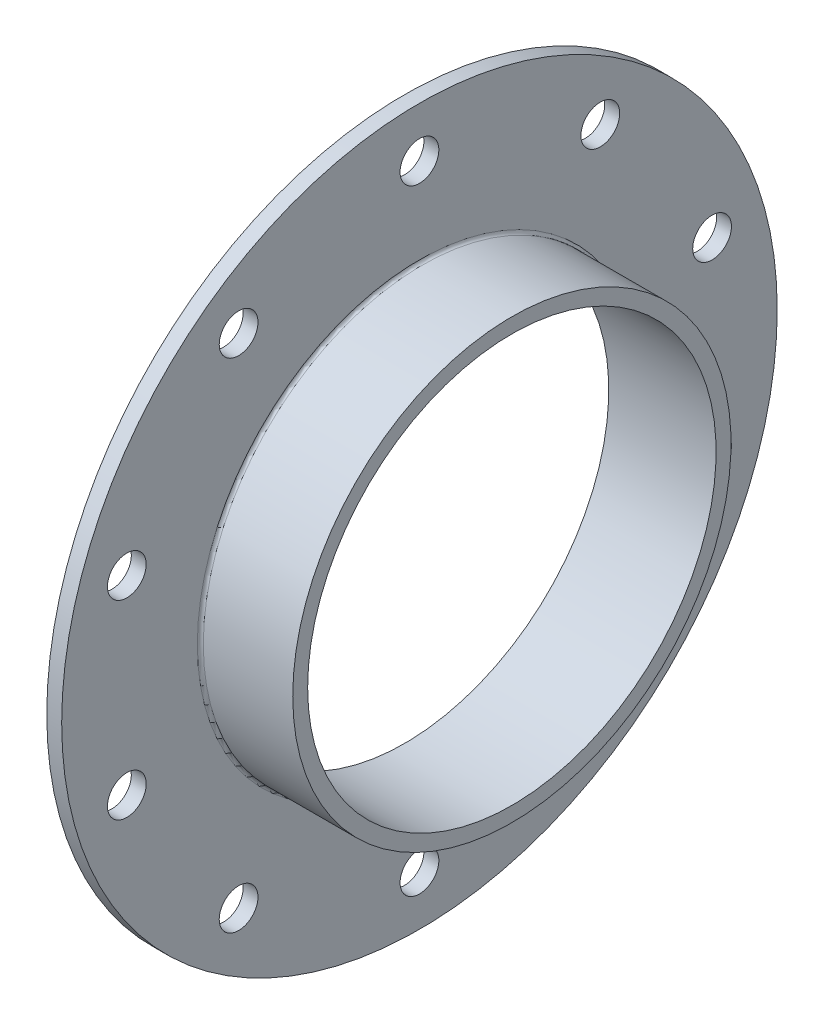
ISO-10303-21;
HEADER;
FILE_DESCRIPTION(('STEP AP214'),'2;1');
FILE_NAME('part.step','',(''),(''),'','','');
FILE_SCHEMA(('AUTOMOTIVE_DESIGN { 1 0 10303 214 1 1 1 1 }'));
ENDSEC;
DATA;
#1=APPLICATION_CONTEXT('core data for automotive mechanical design processes');
#2=APPLICATION_PROTOCOL_DEFINITION('international standard','automotive_design',2000,#1);
#3=PRODUCT_CONTEXT('',#1,'mechanical');
#4=PRODUCT('Part','Part','',(#3));
#5=PRODUCT_RELATED_PRODUCT_CATEGORY('part','',(#4));
#6=PRODUCT_DEFINITION_FORMATION('','',#4);
#7=PRODUCT_DEFINITION_CONTEXT('part definition',#1,'design');
#8=PRODUCT_DEFINITION('design','',#6,#7);
#9=PRODUCT_DEFINITION_SHAPE('','',#8);
#10=(LENGTH_UNIT() NAMED_UNIT(*) SI_UNIT(.MILLI.,.METRE.));
#11=(NAMED_UNIT(*) PLANE_ANGLE_UNIT() SI_UNIT($,.RADIAN.));
#12=(NAMED_UNIT(*) SI_UNIT($,.STERADIAN.) SOLID_ANGLE_UNIT());
#13=UNCERTAINTY_MEASURE_WITH_UNIT(LENGTH_MEASURE(1.E-05),#10,'distance_accuracy_value','');
#14=(GEOMETRIC_REPRESENTATION_CONTEXT(3) GLOBAL_UNCERTAINTY_ASSIGNED_CONTEXT((#13)) GLOBAL_UNIT_ASSIGNED_CONTEXT((#10,
#11,#12)) REPRESENTATION_CONTEXT('',''));
#15=CARTESIAN_POINT('',(0.,0.,0.));
#16=DIRECTION('',(0.,0.,1.));
#17=DIRECTION('',(1.,0.,0.));
#18=AXIS2_PLACEMENT_3D('',#15,#16,#17);
#19=CARTESIAN_POINT('',(0.,0.,0.));
#20=DIRECTION('',(-1.,0.,0.));
#21=DIRECTION('',(0.,0.,1.));
#22=AXIS2_PLACEMENT_3D('',#19,#20,#21);
#23=CYLINDRICAL_SURFACE('',#22,34.25);
#24=CARTESIAN_POINT('',(18.,0.,0.));
#25=DIRECTION('',(-1.,0.,0.));
#26=DIRECTION('',(0.,0.,1.));
#27=AXIS2_PLACEMENT_3D('',#24,#25,#26);
#28=CIRCLE('',#27,34.25);
#29=CARTESIAN_POINT('',(18.,0.,34.25));
#30=VERTEX_POINT('',#29);
#31=EDGE_CURVE('E89',#30,#30,#28,.T.);
#32=ORIENTED_EDGE('',*,*,#31,.F.);
#33=EDGE_LOOP('',(#32));
#34=FACE_BOUND('',#33,.T.);
#35=CARTESIAN_POINT('',(0.,0.,0.));
#36=DIRECTION('',(-1.,0.,0.));
#37=DIRECTION('',(0.,0.,1.));
#38=AXIS2_PLACEMENT_3D('',#35,#36,#37);
#39=CIRCLE('',#38,34.25);
#40=CARTESIAN_POINT('',(0.,0.,34.25));
#41=VERTEX_POINT('',#40);
#42=EDGE_CURVE('E43',#41,#41,#39,.T.);
#43=ORIENTED_EDGE('',*,*,#42,.T.);
#44=EDGE_LOOP('',(#43));
#45=FACE_BOUND('',#44,.T.);
#46=ADVANCED_FACE('F32',(#34,#45),#23,.F.);
#47=CARTESIAN_POINT('',(0.,34.25,0.));
#48=DIRECTION('',(1.,0.,0.));
#49=DIRECTION('',(0.,0.,-1.));
#50=AXIS2_PLACEMENT_3D('',#47,#48,#49);
#51=PLANE('',#50);
#52=CARTESIAN_POINT('',(0.,41.7452769097477,-30.329719018291));
#53=DIRECTION('',(-1.,0.,0.));
#54=DIRECTION('',(0.,0.,1.));
#55=AXIS2_PLACEMENT_3D('',#52,#53,#54);
#56=CIRCLE('',#55,3.25);
#57=CARTESIAN_POINT('',(0.,41.7452769097477,-27.079719018291));
#58=VERTEX_POINT('',#57);
#59=EDGE_CURVE('E54',#58,#58,#56,.T.);
#60=ORIENTED_EDGE('',*,*,#59,.F.);
#61=EDGE_LOOP('',(#60));
#62=FACE_BOUND('',#61,.T.);
#63=CARTESIAN_POINT('',(0.,15.9452769097478,-49.0745162408297));
#64=DIRECTION('',(-1.,0.,0.));
#65=DIRECTION('',(0.,0.,1.));
#66=AXIS2_PLACEMENT_3D('',#63,#64,#65);
#67=CIRCLE('',#66,3.25);
#68=CARTESIAN_POINT('',(0.,15.9452769097478,-45.8245162408297));
#69=VERTEX_POINT('',#68);
#70=EDGE_CURVE('E53',#69,#69,#67,.T.);
#71=ORIENTED_EDGE('',*,*,#70,.F.);
#72=EDGE_LOOP('',(#71));
#73=FACE_BOUND('',#72,.T.);
#74=CARTESIAN_POINT('',(0.,-15.9452769097468,-49.0745162408301));
#75=DIRECTION('',(-1.,0.,0.));
#76=DIRECTION('',(0.,0.,1.));
#77=AXIS2_PLACEMENT_3D('',#74,#75,#76);
#78=CIRCLE('',#77,3.25);
#79=CARTESIAN_POINT('',(0.,-15.9452769097468,-45.8245162408301));
#80=VERTEX_POINT('',#79);
#81=EDGE_CURVE('E58',#80,#80,#78,.T.);
#82=ORIENTED_EDGE('',*,*,#81,.F.);
#83=EDGE_LOOP('',(#82));
#84=FACE_BOUND('',#83,.T.);
#85=CARTESIAN_POINT('',(0.,-41.745276909747,-30.329719018292));
#86=DIRECTION('',(-1.,0.,0.));
#87=DIRECTION('',(0.,0.,1.));
#88=AXIS2_PLACEMENT_3D('',#85,#86,#87);
#89=CIRCLE('',#88,3.25);
#90=CARTESIAN_POINT('',(0.,-41.745276909747,-27.079719018292));
#91=VERTEX_POINT('',#90);
#92=EDGE_CURVE('E62',#91,#91,#89,.T.);
#93=ORIENTED_EDGE('',*,*,#92,.F.);
#94=EDGE_LOOP('',(#93));
#95=FACE_BOUND('',#94,.T.);
#96=CARTESIAN_POINT('',(0.,-51.6,-3.46944695195361E-13));
#97=DIRECTION('',(-1.,0.,0.));
#98=DIRECTION('',(0.,0.,1.));
#99=AXIS2_PLACEMENT_3D('',#96,#97,#98);
#100=CIRCLE('',#99,3.25);
#101=CARTESIAN_POINT('',(0.,-51.6,3.24999999999965));
#102=VERTEX_POINT('',#101);
#103=EDGE_CURVE('E66',#102,#102,#100,.T.);
#104=ORIENTED_EDGE('',*,*,#103,.F.);
#105=EDGE_LOOP('',(#104));
#106=FACE_BOUND('',#105,.T.);
#107=CARTESIAN_POINT('',(0.,-41.7452769097479,30.3297190182908));
#108=DIRECTION('',(-1.,0.,0.));
#109=DIRECTION('',(0.,0.,1.));
#110=AXIS2_PLACEMENT_3D('',#107,#108,#109);
#111=CIRCLE('',#110,3.25);
#112=CARTESIAN_POINT('',(0.,-41.7452769097479,33.5797190182908));
#113=VERTEX_POINT('',#112);
#114=EDGE_CURVE('E70',#113,#113,#111,.T.);
#115=ORIENTED_EDGE('',*,*,#114,.F.);
#116=EDGE_LOOP('',(#115));
#117=FACE_BOUND('',#116,.T.);
#118=CARTESIAN_POINT('',(0.,-15.9452769097482,49.0745162408296));
#119=DIRECTION('',(-1.,0.,0.));
#120=DIRECTION('',(0.,0.,1.));
#121=AXIS2_PLACEMENT_3D('',#118,#119,#120);
#122=CIRCLE('',#121,3.25);
#123=CARTESIAN_POINT('',(0.,-15.9452769097482,52.3245162408296));
#124=VERTEX_POINT('',#123);
#125=EDGE_CURVE('E74',#124,#124,#122,.T.);
#126=ORIENTED_EDGE('',*,*,#125,.F.);
#127=EDGE_LOOP('',(#126));
#128=FACE_BOUND('',#127,.T.);
#129=CARTESIAN_POINT('',(0.,15.9452769097465,49.0745162408302));
#130=DIRECTION('',(-1.,0.,0.));
#131=DIRECTION('',(0.,0.,1.));
#132=AXIS2_PLACEMENT_3D('',#129,#130,#131);
#133=CIRCLE('',#132,3.25);
#134=CARTESIAN_POINT('',(0.,15.9452769097465,52.3245162408302));
#135=VERTEX_POINT('',#134);
#136=EDGE_CURVE('E78',#135,#135,#133,.T.);
#137=ORIENTED_EDGE('',*,*,#136,.F.);
#138=EDGE_LOOP('',(#137));
#139=FACE_BOUND('',#138,.T.);
#140=CARTESIAN_POINT('',(0.,41.7452769097468,30.3297190182922));
#141=DIRECTION('',(-1.,0.,0.));
#142=DIRECTION('',(0.,0.,1.));
#143=AXIS2_PLACEMENT_3D('',#140,#141,#142);
#144=CIRCLE('',#143,3.25);
#145=CARTESIAN_POINT('',(0.,41.7452769097468,33.5797190182923));
#146=VERTEX_POINT('',#145);
#147=EDGE_CURVE('E82',#146,#146,#144,.T.);
#148=ORIENTED_EDGE('',*,*,#147,.F.);
#149=EDGE_LOOP('',(#148));
#150=FACE_BOUND('',#149,.T.);
#151=CARTESIAN_POINT('',(0.,51.6,0.));
#152=DIRECTION('',(-1.,0.,0.));
#153=DIRECTION('',(0.,0.,1.));
#154=AXIS2_PLACEMENT_3D('',#151,#152,#153);
#155=CIRCLE('',#154,3.25);
#156=CARTESIAN_POINT('',(0.,51.6,3.25));
#157=VERTEX_POINT('',#156);
#158=EDGE_CURVE('E86',#157,#157,#155,.T.);
#159=ORIENTED_EDGE('',*,*,#158,.F.);
#160=EDGE_LOOP('',(#159));
#161=FACE_BOUND('',#160,.T.);
#162=ORIENTED_EDGE('',*,*,#42,.F.);
#163=EDGE_LOOP('',(#162));
#164=FACE_BOUND('',#163,.T.);
#165=CARTESIAN_POINT('',(0.,0.,0.));
#166=DIRECTION('',(-1.,0.,0.));
#167=DIRECTION('',(0.,0.,1.));
#168=AXIS2_PLACEMENT_3D('',#165,#166,#167);
#169=CIRCLE('',#168,60.);
#170=CARTESIAN_POINT('',(0.,0.,60.));
#171=VERTEX_POINT('',#170);
#172=EDGE_CURVE('E47',#171,#171,#169,.T.);
#173=ORIENTED_EDGE('',*,*,#172,.T.);
#174=EDGE_LOOP('',(#173));
#175=FACE_BOUND('',#174,.T.);
#176=ADVANCED_FACE('F125',(#62,#73,#84,#95,#106,#117,#128,#139,#150,#161,#164,#175),#51,.F.);
#177=CARTESIAN_POINT('',(0.,0.,0.));
#178=DIRECTION('',(-1.,0.,0.));
#179=DIRECTION('',(0.,0.,1.));
#180=AXIS2_PLACEMENT_3D('',#177,#178,#179);
#181=CYLINDRICAL_SURFACE('',#180,60.);
#182=ORIENTED_EDGE('',*,*,#172,.F.);
#183=EDGE_LOOP('',(#182));
#184=FACE_BOUND('',#183,.T.);
#185=CARTESIAN_POINT('',(2.5,0.,0.));
#186=DIRECTION('',(-1.,0.,0.));
#187=DIRECTION('',(0.,0.,1.));
#188=AXIS2_PLACEMENT_3D('',#185,#186,#187);
#189=CIRCLE('',#188,60.);
#190=CARTESIAN_POINT('',(2.5,0.,60.));
#191=VERTEX_POINT('',#190);
#192=EDGE_CURVE('E93',#191,#191,#189,.T.);
#193=ORIENTED_EDGE('',*,*,#192,.T.);
#194=EDGE_LOOP('',(#193));
#195=FACE_BOUND('',#194,.T.);
#196=ADVANCED_FACE('F128',(#184,#195),#181,.T.);
#197=CARTESIAN_POINT('',(2.5,60.,0.));
#198=DIRECTION('',(-1.,0.,0.));
#199=DIRECTION('',(0.,0.,1.));
#200=AXIS2_PLACEMENT_3D('',#197,#198,#199);
#201=PLANE('',#200);
#202=CARTESIAN_POINT('',(2.5,0.,0.));
#203=DIRECTION('',(-1.,0.,0.));
#204=DIRECTION('',(0.,0.,1.));
#205=AXIS2_PLACEMENT_3D('',#202,#203,#204);
#206=CIRCLE('',#205,37.25);
#207=CARTESIAN_POINT('',(2.5,0.,37.25));
#208=VERTEX_POINT('',#207);
#209=EDGE_CURVE('E39',#208,#208,#206,.T.);
#210=ORIENTED_EDGE('',*,*,#209,.T.);
#211=EDGE_LOOP('',(#210));
#212=FACE_BOUND('',#211,.T.);
#213=CARTESIAN_POINT('',(2.5,41.7452769097477,-30.329719018291));
#214=DIRECTION('',(-1.,0.,0.));
#215=DIRECTION('',(0.,0.,1.));
#216=AXIS2_PLACEMENT_3D('',#213,#214,#215);
#217=CIRCLE('',#216,3.25);
#218=CARTESIAN_POINT('',(2.5,41.7452769097477,-27.079719018291));
#219=VERTEX_POINT('',#218);
#220=EDGE_CURVE('E50',#219,#219,#217,.T.);
#221=ORIENTED_EDGE('',*,*,#220,.T.);
#222=EDGE_LOOP('',(#221));
#223=FACE_BOUND('',#222,.T.);
#224=CARTESIAN_POINT('',(2.5,15.9452769097478,-49.0745162408297));
#225=DIRECTION('',(-1.,0.,0.));
#226=DIRECTION('',(0.,0.,1.));
#227=AXIS2_PLACEMENT_3D('',#224,#225,#226);
#228=CIRCLE('',#227,3.25);
#229=CARTESIAN_POINT('',(2.5,15.9452769097478,-45.8245162408297));
#230=VERTEX_POINT('',#229);
#231=EDGE_CURVE('E55',#230,#230,#228,.T.);
#232=ORIENTED_EDGE('',*,*,#231,.T.);
#233=EDGE_LOOP('',(#232));
#234=FACE_BOUND('',#233,.T.);
#235=CARTESIAN_POINT('',(2.5,-15.9452769097468,-49.0745162408301));
#236=DIRECTION('',(-1.,0.,0.));
#237=DIRECTION('',(0.,0.,1.));
#238=AXIS2_PLACEMENT_3D('',#235,#236,#237);
#239=CIRCLE('',#238,3.25);
#240=CARTESIAN_POINT('',(2.5,-15.9452769097468,-45.8245162408301));
#241=VERTEX_POINT('',#240);
#242=EDGE_CURVE('E59',#241,#241,#239,.T.);
#243=ORIENTED_EDGE('',*,*,#242,.T.);
#244=EDGE_LOOP('',(#243));
#245=FACE_BOUND('',#244,.T.);
#246=CARTESIAN_POINT('',(2.5,-41.745276909747,-30.329719018292));
#247=DIRECTION('',(-1.,0.,0.));
#248=DIRECTION('',(0.,0.,1.));
#249=AXIS2_PLACEMENT_3D('',#246,#247,#248);
#250=CIRCLE('',#249,3.25);
#251=CARTESIAN_POINT('',(2.5,-41.745276909747,-27.079719018292));
#252=VERTEX_POINT('',#251);
#253=EDGE_CURVE('E63',#252,#252,#250,.T.);
#254=ORIENTED_EDGE('',*,*,#253,.T.);
#255=EDGE_LOOP('',(#254));
#256=FACE_BOUND('',#255,.T.);
#257=CARTESIAN_POINT('',(2.5,-51.6,-3.46944695195361E-13));
#258=DIRECTION('',(-1.,0.,0.));
#259=DIRECTION('',(0.,0.,1.));
#260=AXIS2_PLACEMENT_3D('',#257,#258,#259);
#261=CIRCLE('',#260,3.25);
#262=CARTESIAN_POINT('',(2.5,-51.6,3.24999999999965));
#263=VERTEX_POINT('',#262);
#264=EDGE_CURVE('E67',#263,#263,#261,.T.);
#265=ORIENTED_EDGE('',*,*,#264,.T.);
#266=EDGE_LOOP('',(#265));
#267=FACE_BOUND('',#266,.T.);
#268=CARTESIAN_POINT('',(2.5,-41.7452769097479,30.3297190182908));
#269=DIRECTION('',(-1.,0.,0.));
#270=DIRECTION('',(0.,0.,1.));
#271=AXIS2_PLACEMENT_3D('',#268,#269,#270);
#272=CIRCLE('',#271,3.25);
#273=CARTESIAN_POINT('',(2.5,-41.7452769097479,33.5797190182908));
#274=VERTEX_POINT('',#273);
#275=EDGE_CURVE('E71',#274,#274,#272,.T.);
#276=ORIENTED_EDGE('',*,*,#275,.T.);
#277=EDGE_LOOP('',(#276));
#278=FACE_BOUND('',#277,.T.);
#279=CARTESIAN_POINT('',(2.5,-15.9452769097482,49.0745162408296));
#280=DIRECTION('',(-1.,0.,0.));
#281=DIRECTION('',(0.,0.,1.));
#282=AXIS2_PLACEMENT_3D('',#279,#280,#281);
#283=CIRCLE('',#282,3.25);
#284=CARTESIAN_POINT('',(2.5,-15.9452769097482,52.3245162408296));
#285=VERTEX_POINT('',#284);
#286=EDGE_CURVE('E75',#285,#285,#283,.T.);
#287=ORIENTED_EDGE('',*,*,#286,.T.);
#288=EDGE_LOOP('',(#287));
#289=FACE_BOUND('',#288,.T.);
#290=CARTESIAN_POINT('',(2.5,15.9452769097465,49.0745162408302));
#291=DIRECTION('',(-1.,0.,0.));
#292=DIRECTION('',(0.,0.,1.));
#293=AXIS2_PLACEMENT_3D('',#290,#291,#292);
#294=CIRCLE('',#293,3.25);
#295=CARTESIAN_POINT('',(2.5,15.9452769097465,52.3245162408302));
#296=VERTEX_POINT('',#295);
#297=EDGE_CURVE('E79',#296,#296,#294,.T.);
#298=ORIENTED_EDGE('',*,*,#297,.T.);
#299=EDGE_LOOP('',(#298));
#300=FACE_BOUND('',#299,.T.);
#301=CARTESIAN_POINT('',(2.5,41.7452769097468,30.3297190182922));
#302=DIRECTION('',(-1.,0.,0.));
#303=DIRECTION('',(0.,0.,1.));
#304=AXIS2_PLACEMENT_3D('',#301,#302,#303);
#305=CIRCLE('',#304,3.25);
#306=CARTESIAN_POINT('',(2.5,41.7452769097468,33.5797190182923));
#307=VERTEX_POINT('',#306);
#308=EDGE_CURVE('E83',#307,#307,#305,.T.);
#309=ORIENTED_EDGE('',*,*,#308,.T.);
#310=EDGE_LOOP('',(#309));
#311=FACE_BOUND('',#310,.T.);
#312=CARTESIAN_POINT('',(2.5,51.6,0.));
#313=DIRECTION('',(-1.,0.,0.));
#314=DIRECTION('',(0.,0.,1.));
#315=AXIS2_PLACEMENT_3D('',#312,#313,#314);
#316=CIRCLE('',#315,3.25);
#317=CARTESIAN_POINT('',(2.5,51.6,3.25));
#318=VERTEX_POINT('',#317);
#319=EDGE_CURVE('E87',#318,#318,#316,.T.);
#320=ORIENTED_EDGE('',*,*,#319,.T.);
#321=EDGE_LOOP('',(#320));
#322=FACE_BOUND('',#321,.T.);
#323=ORIENTED_EDGE('',*,*,#192,.F.);
#324=EDGE_LOOP('',(#323));
#325=FACE_BOUND('',#324,.T.);
#326=ADVANCED_FACE('F154',(#212,#223,#234,#245,#256,#267,#278,#289,#300,#311,#322,#325),#201,.F.);
#327=CARTESIAN_POINT('',(0.,0.,0.));
#328=DIRECTION('',(-1.,0.,0.));
#329=DIRECTION('',(0.,0.,1.));
#330=AXIS2_PLACEMENT_3D('',#327,#328,#329);
#331=CYLINDRICAL_SURFACE('',#330,36.75);
#332=CARTESIAN_POINT('',(3.,0.,0.));
#333=DIRECTION('',(-1.,0.,0.));
#334=DIRECTION('',(0.,0.,1.));
#335=AXIS2_PLACEMENT_3D('',#332,#333,#334);
#336=CIRCLE('',#335,36.75);
#337=CARTESIAN_POINT('',(3.,0.,36.75));
#338=VERTEX_POINT('',#337);
#339=EDGE_CURVE('E10',#338,#338,#336,.F.);
#340=ORIENTED_EDGE('',*,*,#339,.T.);
#341=EDGE_LOOP('',(#340));
#342=FACE_BOUND('',#341,.T.);
#343=CARTESIAN_POINT('',(18.,0.,0.));
#344=DIRECTION('',(-1.,0.,0.));
#345=DIRECTION('',(0.,0.,1.));
#346=AXIS2_PLACEMENT_3D('',#343,#344,#345);
#347=CIRCLE('',#346,36.75);
#348=CARTESIAN_POINT('',(18.,0.,36.75));
#349=VERTEX_POINT('',#348);
#350=EDGE_CURVE('E96',#349,#349,#347,.T.);
#351=ORIENTED_EDGE('',*,*,#350,.T.);
#352=EDGE_LOOP('',(#351));
#353=FACE_BOUND('',#352,.T.);
#354=ADVANCED_FACE('F159',(#342,#353),#331,.T.);
#355=CARTESIAN_POINT('',(18.,36.75,0.));
#356=DIRECTION('',(-1.,0.,0.));
#357=DIRECTION('',(0.,0.,1.));
#358=AXIS2_PLACEMENT_3D('',#355,#356,#357);
#359=PLANE('',#358);
#360=ORIENTED_EDGE('',*,*,#350,.F.);
#361=EDGE_LOOP('',(#360));
#362=FACE_BOUND('',#361,.T.);
#363=ORIENTED_EDGE('',*,*,#31,.T.);
#364=EDGE_LOOP('',(#363));
#365=FACE_BOUND('',#364,.T.);
#366=ADVANCED_FACE('F164',(#362,#365),#359,.F.);
#367=CARTESIAN_POINT('',(10.,51.6,0.));
#368=DIRECTION('',(-1.,0.,0.));
#369=DIRECTION('',(0.,0.,1.));
#370=AXIS2_PLACEMENT_3D('',#367,#368,#369);
#371=CYLINDRICAL_SURFACE('',#370,3.25);
#372=ORIENTED_EDGE('',*,*,#158,.T.);
#373=EDGE_LOOP('',(#372));
#374=FACE_BOUND('',#373,.T.);
#375=ORIENTED_EDGE('',*,*,#319,.F.);
#376=EDGE_LOOP('',(#375));
#377=FACE_BOUND('',#376,.T.);
#378=ADVANCED_FACE('F175',(#374,#377),#371,.F.);
#379=CARTESIAN_POINT('',(10.,41.7452769097468,30.3297190182922));
#380=DIRECTION('',(-1.,0.,0.));
#381=DIRECTION('',(0.,0.,1.));
#382=AXIS2_PLACEMENT_3D('',#379,#380,#381);
#383=CYLINDRICAL_SURFACE('',#382,3.25);
#384=ORIENTED_EDGE('',*,*,#147,.T.);
#385=EDGE_LOOP('',(#384));
#386=FACE_BOUND('',#385,.T.);
#387=ORIENTED_EDGE('',*,*,#308,.F.);
#388=EDGE_LOOP('',(#387));
#389=FACE_BOUND('',#388,.T.);
#390=ADVANCED_FACE('F181',(#386,#389),#383,.F.);
#391=CARTESIAN_POINT('',(10.,15.9452769097465,49.0745162408302));
#392=DIRECTION('',(-1.,0.,0.));
#393=DIRECTION('',(0.,0.,1.));
#394=AXIS2_PLACEMENT_3D('',#391,#392,#393);
#395=CYLINDRICAL_SURFACE('',#394,3.25);
#396=ORIENTED_EDGE('',*,*,#136,.T.);
#397=EDGE_LOOP('',(#396));
#398=FACE_BOUND('',#397,.T.);
#399=ORIENTED_EDGE('',*,*,#297,.F.);
#400=EDGE_LOOP('',(#399));
#401=FACE_BOUND('',#400,.T.);
#402=ADVANCED_FACE('F188',(#398,#401),#395,.F.);
#403=CARTESIAN_POINT('',(10.,-15.9452769097482,49.0745162408296));
#404=DIRECTION('',(-1.,0.,0.));
#405=DIRECTION('',(0.,0.,1.));
#406=AXIS2_PLACEMENT_3D('',#403,#404,#405);
#407=CYLINDRICAL_SURFACE('',#406,3.25);
#408=ORIENTED_EDGE('',*,*,#125,.T.);
#409=EDGE_LOOP('',(#408));
#410=FACE_BOUND('',#409,.T.);
#411=ORIENTED_EDGE('',*,*,#286,.F.);
#412=EDGE_LOOP('',(#411));
#413=FACE_BOUND('',#412,.T.);
#414=ADVANCED_FACE('F192',(#410,#413),#407,.F.);
#415=CARTESIAN_POINT('',(10.,-41.7452769097479,30.3297190182908));
#416=DIRECTION('',(-1.,0.,0.));
#417=DIRECTION('',(0.,0.,1.));
#418=AXIS2_PLACEMENT_3D('',#415,#416,#417);
#419=CYLINDRICAL_SURFACE('',#418,3.25);
#420=ORIENTED_EDGE('',*,*,#114,.T.);
#421=EDGE_LOOP('',(#420));
#422=FACE_BOUND('',#421,.T.);
#423=ORIENTED_EDGE('',*,*,#275,.F.);
#424=EDGE_LOOP('',(#423));
#425=FACE_BOUND('',#424,.T.);
#426=ADVANCED_FACE('F196',(#422,#425),#419,.F.);
#427=CARTESIAN_POINT('',(10.,-51.6,-3.46944695195361E-13));
#428=DIRECTION('',(-1.,0.,0.));
#429=DIRECTION('',(0.,0.,1.));
#430=AXIS2_PLACEMENT_3D('',#427,#428,#429);
#431=CYLINDRICAL_SURFACE('',#430,3.25);
#432=ORIENTED_EDGE('',*,*,#103,.T.);
#433=EDGE_LOOP('',(#432));
#434=FACE_BOUND('',#433,.T.);
#435=ORIENTED_EDGE('',*,*,#264,.F.);
#436=EDGE_LOOP('',(#435));
#437=FACE_BOUND('',#436,.T.);
#438=ADVANCED_FACE('F200',(#434,#437),#431,.F.);
#439=CARTESIAN_POINT('',(10.,-41.745276909747,-30.329719018292));
#440=DIRECTION('',(-1.,0.,0.));
#441=DIRECTION('',(0.,0.,1.));
#442=AXIS2_PLACEMENT_3D('',#439,#440,#441);
#443=CYLINDRICAL_SURFACE('',#442,3.25);
#444=ORIENTED_EDGE('',*,*,#92,.T.);
#445=EDGE_LOOP('',(#444));
#446=FACE_BOUND('',#445,.T.);
#447=ORIENTED_EDGE('',*,*,#253,.F.);
#448=EDGE_LOOP('',(#447));
#449=FACE_BOUND('',#448,.T.);
#450=ADVANCED_FACE('F204',(#446,#449),#443,.F.);
#451=CARTESIAN_POINT('',(10.,-15.9452769097468,-49.0745162408301));
#452=DIRECTION('',(-1.,0.,0.));
#453=DIRECTION('',(0.,0.,1.));
#454=AXIS2_PLACEMENT_3D('',#451,#452,#453);
#455=CYLINDRICAL_SURFACE('',#454,3.25);
#456=ORIENTED_EDGE('',*,*,#81,.T.);
#457=EDGE_LOOP('',(#456));
#458=FACE_BOUND('',#457,.T.);
#459=ORIENTED_EDGE('',*,*,#242,.F.);
#460=EDGE_LOOP('',(#459));
#461=FACE_BOUND('',#460,.T.);
#462=ADVANCED_FACE('F208',(#458,#461),#455,.F.);
#463=CARTESIAN_POINT('',(10.,15.9452769097478,-49.0745162408297));
#464=DIRECTION('',(-1.,0.,0.));
#465=DIRECTION('',(0.,0.,1.));
#466=AXIS2_PLACEMENT_3D('',#463,#464,#465);
#467=CYLINDRICAL_SURFACE('',#466,3.25);
#468=ORIENTED_EDGE('',*,*,#70,.T.);
#469=EDGE_LOOP('',(#468));
#470=FACE_BOUND('',#469,.T.);
#471=ORIENTED_EDGE('',*,*,#231,.F.);
#472=EDGE_LOOP('',(#471));
#473=FACE_BOUND('',#472,.T.);
#474=ADVANCED_FACE('F212',(#470,#473),#467,.F.);
#475=CARTESIAN_POINT('',(10.,41.7452769097477,-30.329719018291));
#476=DIRECTION('',(-1.,0.,0.));
#477=DIRECTION('',(0.,0.,1.));
#478=AXIS2_PLACEMENT_3D('',#475,#476,#477);
#479=CYLINDRICAL_SURFACE('',#478,3.25);
#480=ORIENTED_EDGE('',*,*,#59,.T.);
#481=EDGE_LOOP('',(#480));
#482=FACE_BOUND('',#481,.T.);
#483=ORIENTED_EDGE('',*,*,#220,.F.);
#484=EDGE_LOOP('',(#483));
#485=FACE_BOUND('',#484,.T.);
#486=ADVANCED_FACE('F122',(#482,#485),#479,.F.);
#487=CARTESIAN_POINT('',(3.,0.,0.));
#488=DIRECTION('',(-1.,0.,0.));
#489=DIRECTION('',(0.,0.,1.));
#490=AXIS2_PLACEMENT_3D('',#487,#488,#489);
#491=TOROIDAL_SURFACE('',#490,37.25,0.5);
#492=ORIENTED_EDGE('',*,*,#339,.F.);
#493=EDGE_LOOP('',(#492));
#494=FACE_BOUND('',#493,.T.);
#495=ORIENTED_EDGE('',*,*,#209,.F.);
#496=EDGE_LOOP('',(#495));
#497=FACE_BOUND('',#496,.T.);
#498=ADVANCED_FACE('F34',(#494,#497),#491,.F.);
#499=CLOSED_SHELL('',(#46,#176,#196,#326,#354,#366,#378,#390,#402,#414,#426,#438,#450,#462,#474,
#486,#498));
#500=MANIFOLD_SOLID_BREP('B2',#499);
#501=ADVANCED_BREP_SHAPE_REPRESENTATION('',(#18,#500),#14);
#502=SHAPE_DEFINITION_REPRESENTATION(#9,#501);
ENDSEC;
END-ISO-10303-21;
